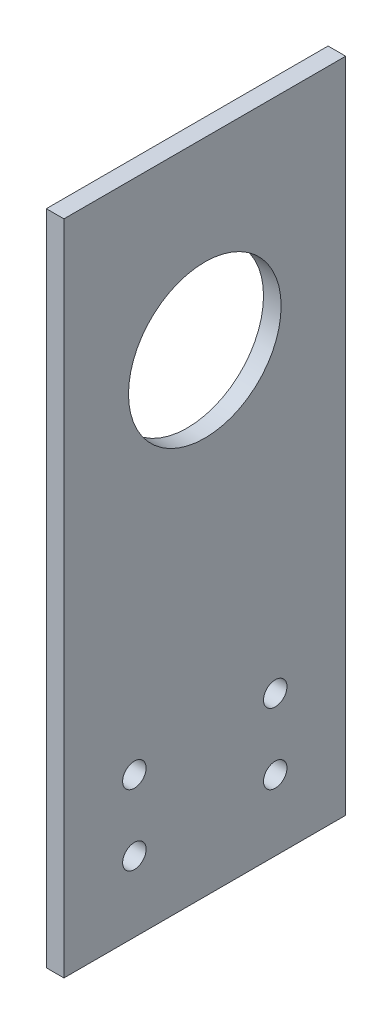
ISO-10303-21;
HEADER;
FILE_DESCRIPTION(('STEP AP214'),'2;1');
FILE_NAME('part.step','',(''),(''),'','','');
FILE_SCHEMA(('AUTOMOTIVE_DESIGN { 1 0 10303 214 1 1 1 1 }'));
ENDSEC;
DATA;
#1=APPLICATION_CONTEXT('core data for automotive mechanical design processes');
#2=APPLICATION_PROTOCOL_DEFINITION('international standard','automotive_design',2000,#1);
#3=PRODUCT_CONTEXT('',#1,'mechanical');
#4=PRODUCT('Part','Part','',(#3));
#5=PRODUCT_RELATED_PRODUCT_CATEGORY('part','',(#4));
#6=PRODUCT_DEFINITION_FORMATION('','',#4);
#7=PRODUCT_DEFINITION_CONTEXT('part definition',#1,'design');
#8=PRODUCT_DEFINITION('design','',#6,#7);
#9=PRODUCT_DEFINITION_SHAPE('','',#8);
#10=(LENGTH_UNIT() NAMED_UNIT(*) SI_UNIT(.MILLI.,.METRE.));
#11=(NAMED_UNIT(*) PLANE_ANGLE_UNIT() SI_UNIT($,.RADIAN.));
#12=(NAMED_UNIT(*) SI_UNIT($,.STERADIAN.) SOLID_ANGLE_UNIT());
#13=UNCERTAINTY_MEASURE_WITH_UNIT(LENGTH_MEASURE(1.E-05),#10,'distance_accuracy_value','');
#14=(GEOMETRIC_REPRESENTATION_CONTEXT(3) GLOBAL_UNCERTAINTY_ASSIGNED_CONTEXT((#13)) GLOBAL_UNIT_ASSIGNED_CONTEXT((#10,
#11,#12)) REPRESENTATION_CONTEXT('',''));
#15=CARTESIAN_POINT('',(0.,0.,0.));
#16=DIRECTION('',(0.,0.,1.));
#17=DIRECTION('',(1.,0.,0.));
#18=AXIS2_PLACEMENT_3D('',#15,#16,#17);
#19=CARTESIAN_POINT('',(4.7625,88.9,-38.1));
#20=DIRECTION('',(0.,0.,1.));
#21=DIRECTION('',(0.,-1.,0.));
#22=AXIS2_PLACEMENT_3D('',#19,#20,#21);
#23=PLANE('',#22);
#24=DIRECTION('',(0.,1.,0.));
#25=VECTOR('',#24,1.);
#26=CARTESIAN_POINT('',(0.,88.9,-38.1));
#27=LINE('',#26,#25);
#28=CARTESIAN_POINT('',(0.,-88.9,-38.1));
#29=VERTEX_POINT('',#28);
#30=CARTESIAN_POINT('',(0.,88.9,-38.1));
#31=VERTEX_POINT('',#30);
#32=EDGE_CURVE('E96',#29,#31,#27,.T.);
#33=ORIENTED_EDGE('',*,*,#32,.T.);
#34=DIRECTION('',(-1.,0.,0.));
#35=VECTOR('',#34,1.);
#36=CARTESIAN_POINT('',(4.7625,88.9,-38.1));
#37=LINE('',#36,#35);
#38=CARTESIAN_POINT('',(4.7625,88.9,-38.1));
#39=VERTEX_POINT('',#38);
#40=EDGE_CURVE('E11',#39,#31,#37,.T.);
#41=ORIENTED_EDGE('',*,*,#40,.F.);
#42=DIRECTION('',(0.,1.,0.));
#43=VECTOR('',#42,1.);
#44=CARTESIAN_POINT('',(4.7625,88.9,-38.1));
#45=LINE('',#44,#43);
#46=CARTESIAN_POINT('',(4.7625,-88.9,-38.1));
#47=VERTEX_POINT('',#46);
#48=EDGE_CURVE('E84',#47,#39,#45,.T.);
#49=ORIENTED_EDGE('',*,*,#48,.F.);
#50=DIRECTION('',(-1.,0.,0.));
#51=VECTOR('',#50,1.);
#52=CARTESIAN_POINT('',(4.7625,-88.9,-38.1));
#53=LINE('',#52,#51);
#54=EDGE_CURVE('E92',#47,#29,#53,.T.);
#55=ORIENTED_EDGE('',*,*,#54,.T.);
#56=EDGE_LOOP('',(#33,#41,#49,#55));
#57=FACE_BOUND('',#56,.T.);
#58=ADVANCED_FACE('F33',(#57),#23,.F.);
#59=CARTESIAN_POINT('',(4.7625,88.9,38.1));
#60=DIRECTION('',(0.,-1.,0.));
#61=DIRECTION('',(0.,0.,-1.));
#62=AXIS2_PLACEMENT_3D('',#59,#60,#61);
#63=PLANE('',#62);
#64=DIRECTION('',(0.,0.,1.));
#65=VECTOR('',#64,1.);
#66=CARTESIAN_POINT('',(0.,88.9,38.1));
#67=LINE('',#66,#65);
#68=CARTESIAN_POINT('',(0.,88.9,38.1));
#69=VERTEX_POINT('',#68);
#70=EDGE_CURVE('E88',#31,#69,#67,.T.);
#71=ORIENTED_EDGE('',*,*,#70,.T.);
#72=DIRECTION('',(-1.,0.,0.));
#73=VECTOR('',#72,1.);
#74=CARTESIAN_POINT('',(4.7625,88.9,38.1));
#75=LINE('',#74,#73);
#76=CARTESIAN_POINT('',(4.7625,88.9,38.1));
#77=VERTEX_POINT('',#76);
#78=EDGE_CURVE('E41',#77,#69,#75,.T.);
#79=ORIENTED_EDGE('',*,*,#78,.F.);
#80=DIRECTION('',(0.,0.,1.));
#81=VECTOR('',#80,1.);
#82=CARTESIAN_POINT('',(4.7625,88.9,38.1));
#83=LINE('',#82,#81);
#84=EDGE_CURVE('E79',#39,#77,#83,.T.);
#85=ORIENTED_EDGE('',*,*,#84,.F.);
#86=ORIENTED_EDGE('',*,*,#40,.T.);
#87=EDGE_LOOP('',(#71,#79,#85,#86));
#88=FACE_BOUND('',#87,.T.);
#89=ADVANCED_FACE('F87',(#88),#63,.F.);
#90=CARTESIAN_POINT('',(4.7625,88.9,38.1));
#91=DIRECTION('',(0.,0.,-1.));
#92=DIRECTION('',(0.,1.,0.));
#93=AXIS2_PLACEMENT_3D('',#90,#91,#92);
#94=PLANE('',#93);
#95=DIRECTION('',(0.,-1.,0.));
#96=VECTOR('',#95,1.);
#97=CARTESIAN_POINT('',(0.,88.9,38.1));
#98=LINE('',#97,#96);
#99=CARTESIAN_POINT('',(0.,-88.9,38.1));
#100=VERTEX_POINT('',#99);
#101=EDGE_CURVE('E66',#69,#100,#98,.T.);
#102=ORIENTED_EDGE('',*,*,#101,.T.);
#103=DIRECTION('',(-1.,0.,0.));
#104=VECTOR('',#103,1.);
#105=CARTESIAN_POINT('',(4.7625,-88.9,38.1));
#106=LINE('',#105,#104);
#107=CARTESIAN_POINT('',(4.7625,-88.9,38.1));
#108=VERTEX_POINT('',#107);
#109=EDGE_CURVE('E89',#108,#100,#106,.T.);
#110=ORIENTED_EDGE('',*,*,#109,.F.);
#111=DIRECTION('',(0.,-1.,0.));
#112=VECTOR('',#111,1.);
#113=CARTESIAN_POINT('',(4.7625,88.9,38.1));
#114=LINE('',#113,#112);
#115=EDGE_CURVE('E82',#77,#108,#114,.T.);
#116=ORIENTED_EDGE('',*,*,#115,.F.);
#117=ORIENTED_EDGE('',*,*,#78,.T.);
#118=EDGE_LOOP('',(#102,#110,#116,#117));
#119=FACE_BOUND('',#118,.T.);
#120=ADVANCED_FACE('F90',(#119),#94,.F.);
#121=CARTESIAN_POINT('',(4.7625,-88.9,38.1));
#122=DIRECTION('',(0.,1.,0.));
#123=DIRECTION('',(0.,0.,1.));
#124=AXIS2_PLACEMENT_3D('',#121,#122,#123);
#125=PLANE('',#124);
#126=DIRECTION('',(0.,0.,-1.));
#127=VECTOR('',#126,1.);
#128=CARTESIAN_POINT('',(0.,-88.9,38.1));
#129=LINE('',#128,#127);
#130=EDGE_CURVE('E72',#100,#29,#129,.T.);
#131=ORIENTED_EDGE('',*,*,#130,.T.);
#132=ORIENTED_EDGE('',*,*,#54,.F.);
#133=DIRECTION('',(0.,0.,-1.));
#134=VECTOR('',#133,1.);
#135=CARTESIAN_POINT('',(4.7625,-88.9,38.1));
#136=LINE('',#135,#134);
#137=EDGE_CURVE('E49',#108,#47,#136,.T.);
#138=ORIENTED_EDGE('',*,*,#137,.F.);
#139=ORIENTED_EDGE('',*,*,#109,.T.);
#140=EDGE_LOOP('',(#131,#132,#138,#139));
#141=FACE_BOUND('',#140,.T.);
#142=ADVANCED_FACE('F104',(#141),#125,.F.);
#143=CARTESIAN_POINT('',(4.7625,0.,0.));
#144=DIRECTION('',(1.,0.,0.));
#145=DIRECTION('',(0.,0.,-1.));
#146=AXIS2_PLACEMENT_3D('',#143,#144,#145);
#147=PLANE('',#146);
#148=CARTESIAN_POINT('',(4.7625,-69.85,19.0499999999995));
#149=DIRECTION('',(1.,0.,0.));
#150=DIRECTION('',(0.,0.,-1.));
#151=AXIS2_PLACEMENT_3D('',#148,#149,#150);
#152=CIRCLE('',#151,3.175);
#153=CARTESIAN_POINT('',(4.7625,-69.85,15.8749999999995));
#154=VERTEX_POINT('',#153);
#155=EDGE_CURVE('E136',#154,#154,#152,.T.);
#156=ORIENTED_EDGE('',*,*,#155,.F.);
#157=EDGE_LOOP('',(#156));
#158=FACE_BOUND('',#157,.T.);
#159=CARTESIAN_POINT('',(4.7625,-69.85,-19.0500000000005));
#160=DIRECTION('',(1.,0.,0.));
#161=DIRECTION('',(0.,0.,-1.));
#162=AXIS2_PLACEMENT_3D('',#159,#160,#161);
#163=CIRCLE('',#162,3.175);
#164=CARTESIAN_POINT('',(4.7625,-69.85,-22.2250000000005));
#165=VERTEX_POINT('',#164);
#166=EDGE_CURVE('E130',#165,#165,#163,.T.);
#167=ORIENTED_EDGE('',*,*,#166,.F.);
#168=EDGE_LOOP('',(#167));
#169=FACE_BOUND('',#168,.T.);
#170=CARTESIAN_POINT('',(4.7625,-50.8,-19.05));
#171=DIRECTION('',(1.,0.,0.));
#172=DIRECTION('',(0.,0.,-1.));
#173=AXIS2_PLACEMENT_3D('',#170,#171,#172);
#174=CIRCLE('',#173,3.175);
#175=CARTESIAN_POINT('',(4.7625,-50.8,-22.225));
#176=VERTEX_POINT('',#175);
#177=EDGE_CURVE('E124',#176,#176,#174,.T.);
#178=ORIENTED_EDGE('',*,*,#177,.F.);
#179=EDGE_LOOP('',(#178));
#180=FACE_BOUND('',#179,.T.);
#181=CARTESIAN_POINT('',(4.7625,-50.8,19.05));
#182=DIRECTION('',(1.,0.,0.));
#183=DIRECTION('',(0.,0.,-1.));
#184=AXIS2_PLACEMENT_3D('',#181,#182,#183);
#185=CIRCLE('',#184,3.175);
#186=CARTESIAN_POINT('',(4.7625,-50.8,15.875));
#187=VERTEX_POINT('',#186);
#188=EDGE_CURVE('E118',#187,#187,#185,.T.);
#189=ORIENTED_EDGE('',*,*,#188,.F.);
#190=EDGE_LOOP('',(#189));
#191=FACE_BOUND('',#190,.T.);
#192=CARTESIAN_POINT('',(4.7625,39.116,0.));
#193=DIRECTION('',(1.,0.,0.));
#194=DIRECTION('',(0.,0.,-1.));
#195=AXIS2_PLACEMENT_3D('',#192,#193,#194);
#196=CIRCLE('',#195,20.6375);
#197=CARTESIAN_POINT('',(4.7625,39.116,-20.6375));
#198=VERTEX_POINT('',#197);
#199=EDGE_CURVE('E112',#198,#198,#196,.T.);
#200=ORIENTED_EDGE('',*,*,#199,.F.);
#201=EDGE_LOOP('',(#200));
#202=FACE_BOUND('',#201,.T.);
#203=ORIENTED_EDGE('',*,*,#48,.T.);
#204=ORIENTED_EDGE('',*,*,#84,.T.);
#205=ORIENTED_EDGE('',*,*,#115,.T.);
#206=ORIENTED_EDGE('',*,*,#137,.T.);
#207=EDGE_LOOP('',(#203,#204,#205,#206));
#208=FACE_BOUND('',#207,.T.);
#209=ADVANCED_FACE('F80',(#158,#169,#180,#191,#202,#208),#147,.T.);
#210=CARTESIAN_POINT('',(0.,0.,0.));
#211=DIRECTION('',(1.,0.,0.));
#212=DIRECTION('',(0.,0.,-1.));
#213=AXIS2_PLACEMENT_3D('',#210,#211,#212);
#214=PLANE('',#213);
#215=CARTESIAN_POINT('',(0.,-69.85,19.0499999999995));
#216=DIRECTION('',(1.,0.,0.));
#217=DIRECTION('',(0.,0.,-1.));
#218=AXIS2_PLACEMENT_3D('',#215,#216,#217);
#219=CIRCLE('',#218,3.175);
#220=CARTESIAN_POINT('',(0.,-69.85,15.8749999999995));
#221=VERTEX_POINT('',#220);
#222=EDGE_CURVE('E133',#221,#221,#219,.F.);
#223=ORIENTED_EDGE('',*,*,#222,.F.);
#224=EDGE_LOOP('',(#223));
#225=FACE_BOUND('',#224,.T.);
#226=CARTESIAN_POINT('',(0.,-69.85,-19.0500000000005));
#227=DIRECTION('',(1.,0.,0.));
#228=DIRECTION('',(0.,0.,-1.));
#229=AXIS2_PLACEMENT_3D('',#226,#227,#228);
#230=CIRCLE('',#229,3.175);
#231=CARTESIAN_POINT('',(0.,-69.85,-22.2250000000005));
#232=VERTEX_POINT('',#231);
#233=EDGE_CURVE('E127',#232,#232,#230,.F.);
#234=ORIENTED_EDGE('',*,*,#233,.F.);
#235=EDGE_LOOP('',(#234));
#236=FACE_BOUND('',#235,.T.);
#237=CARTESIAN_POINT('',(0.,-50.8,-19.05));
#238=DIRECTION('',(1.,0.,0.));
#239=DIRECTION('',(0.,0.,-1.));
#240=AXIS2_PLACEMENT_3D('',#237,#238,#239);
#241=CIRCLE('',#240,3.175);
#242=CARTESIAN_POINT('',(0.,-50.8,-22.225));
#243=VERTEX_POINT('',#242);
#244=EDGE_CURVE('E121',#243,#243,#241,.F.);
#245=ORIENTED_EDGE('',*,*,#244,.F.);
#246=EDGE_LOOP('',(#245));
#247=FACE_BOUND('',#246,.T.);
#248=CARTESIAN_POINT('',(0.,-50.8,19.05));
#249=DIRECTION('',(1.,0.,0.));
#250=DIRECTION('',(0.,0.,-1.));
#251=AXIS2_PLACEMENT_3D('',#248,#249,#250);
#252=CIRCLE('',#251,3.175);
#253=CARTESIAN_POINT('',(0.,-50.8,15.875));
#254=VERTEX_POINT('',#253);
#255=EDGE_CURVE('E115',#254,#254,#252,.F.);
#256=ORIENTED_EDGE('',*,*,#255,.F.);
#257=EDGE_LOOP('',(#256));
#258=FACE_BOUND('',#257,.T.);
#259=CARTESIAN_POINT('',(0.,39.116,0.));
#260=DIRECTION('',(1.,0.,0.));
#261=DIRECTION('',(0.,0.,-1.));
#262=AXIS2_PLACEMENT_3D('',#259,#260,#261);
#263=CIRCLE('',#262,20.6375);
#264=CARTESIAN_POINT('',(0.,39.116,-20.6375));
#265=VERTEX_POINT('',#264);
#266=EDGE_CURVE('E99',#265,#265,#263,.F.);
#267=ORIENTED_EDGE('',*,*,#266,.F.);
#268=EDGE_LOOP('',(#267));
#269=FACE_BOUND('',#268,.T.);
#270=ORIENTED_EDGE('',*,*,#32,.F.);
#271=ORIENTED_EDGE('',*,*,#130,.F.);
#272=ORIENTED_EDGE('',*,*,#101,.F.);
#273=ORIENTED_EDGE('',*,*,#70,.F.);
#274=EDGE_LOOP('',(#270,#271,#272,#273));
#275=FACE_BOUND('',#274,.T.);
#276=ADVANCED_FACE('F107',(#225,#236,#247,#258,#269,#275),#214,.F.);
#277=CARTESIAN_POINT('',(-0.00100000000000013,39.116,0.));
#278=DIRECTION('',(1.,0.,0.));
#279=DIRECTION('',(0.,0.,-1.));
#280=AXIS2_PLACEMENT_3D('',#277,#278,#279);
#281=CYLINDRICAL_SURFACE('',#280,20.6375);
#282=ORIENTED_EDGE('',*,*,#199,.T.);
#283=EDGE_LOOP('',(#282));
#284=FACE_BOUND('',#283,.T.);
#285=ORIENTED_EDGE('',*,*,#266,.T.);
#286=EDGE_LOOP('',(#285));
#287=FACE_BOUND('',#286,.T.);
#288=ADVANCED_FACE('F154',(#284,#287),#281,.F.);
#289=CARTESIAN_POINT('',(-0.00100000000000013,-50.8,19.05));
#290=DIRECTION('',(1.,0.,0.));
#291=DIRECTION('',(0.,0.,-1.));
#292=AXIS2_PLACEMENT_3D('',#289,#290,#291);
#293=CYLINDRICAL_SURFACE('',#292,3.175);
#294=ORIENTED_EDGE('',*,*,#188,.T.);
#295=EDGE_LOOP('',(#294));
#296=FACE_BOUND('',#295,.T.);
#297=ORIENTED_EDGE('',*,*,#255,.T.);
#298=EDGE_LOOP('',(#297));
#299=FACE_BOUND('',#298,.T.);
#300=ADVANCED_FACE('F157',(#296,#299),#293,.F.);
#301=CARTESIAN_POINT('',(-0.00100000000000013,-50.8,-19.05));
#302=DIRECTION('',(1.,0.,0.));
#303=DIRECTION('',(0.,0.,-1.));
#304=AXIS2_PLACEMENT_3D('',#301,#302,#303);
#305=CYLINDRICAL_SURFACE('',#304,3.175);
#306=ORIENTED_EDGE('',*,*,#177,.T.);
#307=EDGE_LOOP('',(#306));
#308=FACE_BOUND('',#307,.T.);
#309=ORIENTED_EDGE('',*,*,#244,.T.);
#310=EDGE_LOOP('',(#309));
#311=FACE_BOUND('',#310,.T.);
#312=ADVANCED_FACE('F202',(#308,#311),#305,.F.);
#313=CARTESIAN_POINT('',(-0.00100000000000013,-69.85,-19.0500000000005));
#314=DIRECTION('',(1.,0.,0.));
#315=DIRECTION('',(0.,0.,-1.));
#316=AXIS2_PLACEMENT_3D('',#313,#314,#315);
#317=CYLINDRICAL_SURFACE('',#316,3.175);
#318=ORIENTED_EDGE('',*,*,#166,.T.);
#319=EDGE_LOOP('',(#318));
#320=FACE_BOUND('',#319,.T.);
#321=ORIENTED_EDGE('',*,*,#233,.T.);
#322=EDGE_LOOP('',(#321));
#323=FACE_BOUND('',#322,.T.);
#324=ADVANCED_FACE('F212',(#320,#323),#317,.F.);
#325=CARTESIAN_POINT('',(-0.00100000000000013,-69.85,19.0499999999995));
#326=DIRECTION('',(1.,0.,0.));
#327=DIRECTION('',(0.,0.,-1.));
#328=AXIS2_PLACEMENT_3D('',#325,#326,#327);
#329=CYLINDRICAL_SURFACE('',#328,3.175);
#330=ORIENTED_EDGE('',*,*,#155,.T.);
#331=EDGE_LOOP('',(#330));
#332=FACE_BOUND('',#331,.T.);
#333=ORIENTED_EDGE('',*,*,#222,.T.);
#334=EDGE_LOOP('',(#333));
#335=FACE_BOUND('',#334,.T.);
#336=ADVANCED_FACE('F140',(#332,#335),#329,.F.);
#337=CLOSED_SHELL('',(#58,#89,#120,#142,#209,#276,#288,#300,#312,#324,#336));
#338=MANIFOLD_SOLID_BREP('B2',#337);
#339=ADVANCED_BREP_SHAPE_REPRESENTATION('',(#18,#338),#14);
#340=SHAPE_DEFINITION_REPRESENTATION(#9,#339);
ENDSEC;
END-ISO-10303-21;
